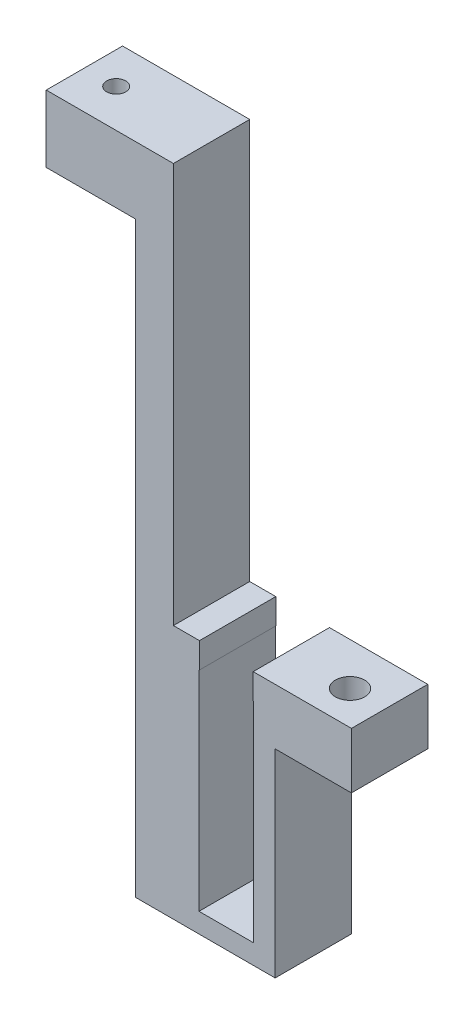
ISO-10303-21;
HEADER;
FILE_DESCRIPTION(('STEP AP214'),'2;1');
FILE_NAME('part.step','',(''),(''),'','','');
FILE_SCHEMA(('AUTOMOTIVE_DESIGN { 1 0 10303 214 1 1 1 1 }'));
ENDSEC;
DATA;
#1=APPLICATION_CONTEXT('core data for automotive mechanical design processes');
#2=APPLICATION_PROTOCOL_DEFINITION('international standard','automotive_design',2000,#1);
#3=PRODUCT_CONTEXT('',#1,'mechanical');
#4=PRODUCT('Part','Part','',(#3));
#5=PRODUCT_RELATED_PRODUCT_CATEGORY('part','',(#4));
#6=PRODUCT_DEFINITION_FORMATION('','',#4);
#7=PRODUCT_DEFINITION_CONTEXT('part definition',#1,'design');
#8=PRODUCT_DEFINITION('design','',#6,#7);
#9=PRODUCT_DEFINITION_SHAPE('','',#8);
#10=(LENGTH_UNIT() NAMED_UNIT(*) SI_UNIT(.MILLI.,.METRE.));
#11=(NAMED_UNIT(*) PLANE_ANGLE_UNIT() SI_UNIT($,.RADIAN.));
#12=(NAMED_UNIT(*) SI_UNIT($,.STERADIAN.) SOLID_ANGLE_UNIT());
#13=UNCERTAINTY_MEASURE_WITH_UNIT(LENGTH_MEASURE(1.E-05),#10,'distance_accuracy_value','');
#14=(GEOMETRIC_REPRESENTATION_CONTEXT(3) GLOBAL_UNCERTAINTY_ASSIGNED_CONTEXT((#13)) GLOBAL_UNIT_ASSIGNED_CONTEXT((#10,
#11,#12)) REPRESENTATION_CONTEXT('',''));
#15=CARTESIAN_POINT('',(0.,0.,0.));
#16=DIRECTION('',(0.,0.,1.));
#17=DIRECTION('',(1.,0.,0.));
#18=AXIS2_PLACEMENT_3D('',#15,#16,#17);
#19=CARTESIAN_POINT('',(-12.686283245385,0.,0.));
#20=DIRECTION('',(1.,0.,0.));
#21=DIRECTION('',(0.,1.,0.));
#22=AXIS2_PLACEMENT_3D('',#19,#20,#21);
#23=PLANE('',#22);
#24=DIRECTION('',(0.,0.,1.));
#25=VECTOR('',#24,1.);
#26=CARTESIAN_POINT('',(-12.686283245385,38.3890826070114,0.));
#27=LINE('',#26,#25);
#28=CARTESIAN_POINT('',(-12.686283245385,38.3890826070114,0.));
#29=VERTEX_POINT('',#28);
#30=CARTESIAN_POINT('',(-12.686283245385,38.3890826070114,6.));
#31=VERTEX_POINT('',#30);
#32=EDGE_CURVE('E50',#29,#31,#27,.T.);
#33=ORIENTED_EDGE('',*,*,#32,.F.);
#34=DIRECTION('',(0.,-1.,0.));
#35=VECTOR('',#34,1.);
#36=CARTESIAN_POINT('',(-12.686283245385,-7.80864350149818,0.));
#37=LINE('',#36,#35);
#38=CARTESIAN_POINT('',(-12.686283245385,-7.80864350149818,0.));
#39=VERTEX_POINT('',#38);
#40=EDGE_CURVE('E343',#29,#39,#37,.T.);
#41=ORIENTED_EDGE('',*,*,#40,.T.);
#42=DIRECTION('',(0.,0.,1.));
#43=VECTOR('',#42,1.);
#44=CARTESIAN_POINT('',(-12.686283245385,-7.80864350149818,0.));
#45=LINE('',#44,#43);
#46=CARTESIAN_POINT('',(-12.686283245385,-7.80864350149818,6.));
#47=VERTEX_POINT('',#46);
#48=EDGE_CURVE('E448',#39,#47,#45,.T.);
#49=ORIENTED_EDGE('',*,*,#48,.T.);
#50=DIRECTION('',(0.,1.,0.));
#51=VECTOR('',#50,1.);
#52=CARTESIAN_POINT('',(-12.686283245385,-7.80864350149818,6.));
#53=LINE('',#52,#51);
#54=EDGE_CURVE('E216',#47,#31,#53,.T.);
#55=ORIENTED_EDGE('',*,*,#54,.T.);
#56=EDGE_LOOP('',(#33,#41,#49,#55));
#57=FACE_BOUND('',#56,.T.);
#58=ADVANCED_FACE('F33',(#57),#23,.F.);
#59=CARTESIAN_POINT('',(-1.68628324538501,12.1913564985018,6.));
#60=DIRECTION('',(-1.,0.,0.));
#61=DIRECTION('',(0.,-1.,0.));
#62=AXIS2_PLACEMENT_3D('',#59,#60,#61);
#63=PLANE('',#62);
#64=DIRECTION('',(0.,0.,-1.));
#65=VECTOR('',#64,1.);
#66=CARTESIAN_POINT('',(-1.68628324538501,7.79606668542954,6.));
#67=LINE('',#66,#65);
#68=CARTESIAN_POINT('',(-1.68628324538501,7.79606668542954,6.));
#69=VERTEX_POINT('',#68);
#70=CARTESIAN_POINT('',(-1.68628324538501,7.79606668542954,0.));
#71=VERTEX_POINT('',#70);
#72=EDGE_CURVE('E58',#69,#71,#67,.T.);
#73=ORIENTED_EDGE('',*,*,#72,.F.);
#74=DIRECTION('',(0.,1.,0.));
#75=VECTOR('',#74,1.);
#76=CARTESIAN_POINT('',(-1.68628324538501,12.1913564985018,6.));
#77=LINE('',#76,#75);
#78=CARTESIAN_POINT('',(-1.68628324538501,-7.80864350149818,6.));
#79=VERTEX_POINT('',#78);
#80=EDGE_CURVE('E168',#79,#69,#77,.T.);
#81=ORIENTED_EDGE('',*,*,#80,.F.);
#82=DIRECTION('',(0.,0.,-1.));
#83=VECTOR('',#82,1.);
#84=CARTESIAN_POINT('',(-1.68628324538501,-7.80864350149818,6.));
#85=LINE('',#84,#83);
#86=CARTESIAN_POINT('',(-1.68628324538501,-7.80864350149818,0.));
#87=VERTEX_POINT('',#86);
#88=EDGE_CURVE('E412',#79,#87,#85,.T.);
#89=ORIENTED_EDGE('',*,*,#88,.T.);
#90=DIRECTION('',(0.,1.,0.));
#91=VECTOR('',#90,1.);
#92=CARTESIAN_POINT('',(-1.68628324538501,12.1913564985018,0.));
#93=LINE('',#92,#91);
#94=EDGE_CURVE('E327',#87,#71,#93,.T.);
#95=ORIENTED_EDGE('',*,*,#94,.T.);
#96=EDGE_LOOP('',(#73,#81,#89,#95));
#97=FACE_BOUND('',#96,.T.);
#98=ADVANCED_FACE('F249',(#97),#63,.F.);
#99=CARTESIAN_POINT('',(-9.68628324538501,12.1913564985018,6.));
#100=DIRECTION('',(0.,-1.,0.));
#101=DIRECTION('',(0.,0.,-1.));
#102=AXIS2_PLACEMENT_3D('',#99,#100,#101);
#103=PLANE('',#102);
#104=CARTESIAN_POINT('',(1.53950418539403,12.1913564985018,3.33665114320771));
#105=DIRECTION('',(0.,1.,0.));
#106=DIRECTION('',(0.,0.,1.));
#107=AXIS2_PLACEMENT_3D('',#104,#105,#106);
#108=CIRCLE('',#107,1.15);
#109=CARTESIAN_POINT('',(1.53950418539403,12.1913564985018,4.48665114320771));
#110=VERTEX_POINT('',#109);
#111=EDGE_CURVE('E188',#110,#110,#108,.T.);
#112=ORIENTED_EDGE('',*,*,#111,.F.);
#113=EDGE_LOOP('',(#112));
#114=FACE_BOUND('',#113,.T.);
#115=DIRECTION('',(-1.,0.,0.));
#116=VECTOR('',#115,1.);
#117=CARTESIAN_POINT('',(-9.68628324538501,12.1913564985018,0.));
#118=LINE('',#117,#116);
#119=CARTESIAN_POINT('',(4.31371675461499,12.1913564985018,0.));
#120=VERTEX_POINT('',#119);
#121=CARTESIAN_POINT('',(-3.41452572534706,12.1913564985018,0.));
#122=VERTEX_POINT('',#121);
#123=EDGE_CURVE('E320',#120,#122,#118,.T.);
#124=ORIENTED_EDGE('',*,*,#123,.T.);
#125=DIRECTION('',(0.,0.,-1.));
#126=VECTOR('',#125,1.);
#127=CARTESIAN_POINT('',(-3.41452572534706,12.1913564985018,0.));
#128=LINE('',#127,#126);
#129=CARTESIAN_POINT('',(-3.41452572534706,12.1913564985018,6.));
#130=VERTEX_POINT('',#129);
#131=EDGE_CURVE('E321',#130,#122,#128,.T.);
#132=ORIENTED_EDGE('',*,*,#131,.F.);
#133=DIRECTION('',(-1.,0.,0.));
#134=VECTOR('',#133,1.);
#135=CARTESIAN_POINT('',(-9.68628324538501,12.1913564985018,6.));
#136=LINE('',#135,#134);
#137=CARTESIAN_POINT('',(4.31371675461499,12.1913564985018,6.));
#138=VERTEX_POINT('',#137);
#139=EDGE_CURVE('E342',#138,#130,#136,.T.);
#140=ORIENTED_EDGE('',*,*,#139,.F.);
#141=DIRECTION('',(0.,0.,1.));
#142=VECTOR('',#141,1.);
#143=CARTESIAN_POINT('',(4.31371675461499,12.1913564985018,6.));
#144=LINE('',#143,#142);
#145=EDGE_CURVE('E185',#120,#138,#144,.T.);
#146=ORIENTED_EDGE('',*,*,#145,.F.);
#147=EDGE_LOOP('',(#124,#132,#140,#146));
#148=FACE_BOUND('',#147,.T.);
#149=ADVANCED_FACE('F256',(#114,#148),#103,.F.);
#150=CARTESIAN_POINT('',(-3.38628324538504,10.1913564985018,-4.));
#151=DIRECTION('',(0.,1.,0.));
#152=DIRECTION('',(0.,0.,1.));
#153=AXIS2_PLACEMENT_3D('',#150,#151,#152);
#154=PLANE('',#153);
#155=DIRECTION('',(-1.,0.,0.));
#156=VECTOR('',#155,1.);
#157=CARTESIAN_POINT('',(-3.38628324538504,10.1913564985018,6.));
#158=LINE('',#157,#156);
#159=CARTESIAN_POINT('',(-3.38628324538504,10.1913564985018,6.));
#160=VERTEX_POINT('',#159);
#161=CARTESIAN_POINT('',(-3.41452572534706,10.1913564985018,6.));
#162=VERTEX_POINT('',#161);
#163=EDGE_CURVE('E375',#160,#162,#158,.T.);
#164=ORIENTED_EDGE('',*,*,#163,.T.);
#165=DIRECTION('',(0.,0.,1.));
#166=VECTOR('',#165,1.);
#167=CARTESIAN_POINT('',(-3.41452572534706,10.1913564985018,0.));
#168=LINE('',#167,#166);
#169=CARTESIAN_POINT('',(-3.41452572534706,10.1913564985018,0.));
#170=VERTEX_POINT('',#169);
#171=EDGE_CURVE('E392',#170,#162,#168,.T.);
#172=ORIENTED_EDGE('',*,*,#171,.F.);
#173=DIRECTION('',(-1.,0.,0.));
#174=VECTOR('',#173,1.);
#175=CARTESIAN_POINT('',(0.,10.1913564985018,0.));
#176=LINE('',#175,#174);
#177=CARTESIAN_POINT('',(-3.38628324538504,10.1913564985018,0.));
#178=VERTEX_POINT('',#177);
#179=EDGE_CURVE('E414',#178,#170,#176,.T.);
#180=ORIENTED_EDGE('',*,*,#179,.F.);
#181=DIRECTION('',(0.,0.,1.));
#182=VECTOR('',#181,1.);
#183=CARTESIAN_POINT('',(-3.38628324538504,10.1913564985018,-4.));
#184=LINE('',#183,#182);
#185=EDGE_CURVE('E366',#178,#160,#184,.T.);
#186=ORIENTED_EDGE('',*,*,#185,.T.);
#187=EDGE_LOOP('',(#164,#172,#180,#186));
#188=FACE_BOUND('',#187,.T.);
#189=ADVANCED_FACE('F290',(#188),#154,.F.);
#190=CARTESIAN_POINT('',(-9.68628324538501,-7.80864350149818,6.));
#191=DIRECTION('',(0.,1.,0.));
#192=DIRECTION('',(0.,0.,1.));
#193=AXIS2_PLACEMENT_3D('',#190,#191,#192);
#194=PLANE('',#193);
#195=DIRECTION('',(1.,0.,0.));
#196=VECTOR('',#195,1.);
#197=CARTESIAN_POINT('',(-9.68628324538501,-7.80864350149818,0.));
#198=LINE('',#197,#196);
#199=EDGE_CURVE('E347',#39,#87,#198,.T.);
#200=ORIENTED_EDGE('',*,*,#199,.T.);
#201=ORIENTED_EDGE('',*,*,#88,.F.);
#202=DIRECTION('',(1.,0.,0.));
#203=VECTOR('',#202,1.);
#204=CARTESIAN_POINT('',(-9.68628324538501,-7.80864350149818,6.));
#205=LINE('',#204,#203);
#206=EDGE_CURVE('E323',#47,#79,#205,.T.);
#207=ORIENTED_EDGE('',*,*,#206,.F.);
#208=ORIENTED_EDGE('',*,*,#48,.F.);
#209=EDGE_LOOP('',(#200,#201,#207,#208));
#210=FACE_BOUND('',#209,.T.);
#211=ADVANCED_FACE('F35',(#210),#194,.F.);
#212=CARTESIAN_POINT('',(-7.63707552946613,12.1913564985018,6.));
#213=VERTEX_POINT('',#212);
#214=CARTESIAN_POINT('',(-9.68628324538501,12.1913564985018,6.));
#215=VERTEX_POINT('',#214);
#216=EDGE_CURVE('E340',#213,#215,#136,.T.);
#217=ORIENTED_EDGE('',*,*,#216,.F.);
#218=DIRECTION('',(0.,0.,1.));
#219=VECTOR('',#218,1.);
#220=CARTESIAN_POINT('',(-7.63707552946613,12.1913564985018,0.));
#221=LINE('',#220,#219);
#222=CARTESIAN_POINT('',(-7.63707552946613,12.1913564985018,0.));
#223=VERTEX_POINT('',#222);
#224=EDGE_CURVE('E394',#223,#213,#221,.T.);
#225=ORIENTED_EDGE('',*,*,#224,.F.);
#226=CARTESIAN_POINT('',(-9.68628324538501,12.1913564985018,0.));
#227=VERTEX_POINT('',#226);
#228=EDGE_CURVE('E324',#223,#227,#118,.T.);
#229=ORIENTED_EDGE('',*,*,#228,.T.);
#230=DIRECTION('',(0.,0.,-1.));
#231=VECTOR('',#230,1.);
#232=CARTESIAN_POINT('',(-9.68628324538501,12.1913564985018,6.));
#233=LINE('',#232,#231);
#234=EDGE_CURVE('E338',#215,#227,#233,.T.);
#235=ORIENTED_EDGE('',*,*,#234,.F.);
#236=EDGE_LOOP('',(#217,#225,#229,#235));
#237=FACE_BOUND('',#236,.T.);
#238=ADVANCED_FACE('F297',(#237),#103,.F.);
#239=CARTESIAN_POINT('',(0.,0.,6.));
#240=DIRECTION('',(0.,0.,1.));
#241=DIRECTION('',(1.,0.,0.));
#242=AXIS2_PLACEMENT_3D('',#239,#240,#241);
#243=PLANE('',#242);
#244=DIRECTION('',(0.,1.,0.));
#245=VECTOR('',#244,1.);
#246=CARTESIAN_POINT('',(-3.41452572534706,-7.80964350149818,6.));
#247=LINE('',#246,#245);
#248=EDGE_CURVE('E387',#162,#130,#247,.T.);
#249=ORIENTED_EDGE('',*,*,#248,.F.);
#250=ORIENTED_EDGE('',*,*,#163,.F.);
#251=DIRECTION('',(0.,1.,0.));
#252=VECTOR('',#251,1.);
#253=CARTESIAN_POINT('',(-3.38628324538504,10.1913564985018,6.));
#254=LINE('',#253,#252);
#255=CARTESIAN_POINT('',(-3.38628324538504,-6.26020039339892,6.));
#256=VERTEX_POINT('',#255);
#257=EDGE_CURVE('E381',#256,#160,#254,.T.);
#258=ORIENTED_EDGE('',*,*,#257,.F.);
#259=DIRECTION('',(1.,0.,0.));
#260=VECTOR('',#259,1.);
#261=CARTESIAN_POINT('',(-3.38628324538504,-6.26020039339892,6.));
#262=LINE('',#261,#260);
#263=CARTESIAN_POINT('',(-7.67544752794524,-6.26020039339892,6.));
#264=VERTEX_POINT('',#263);
#265=EDGE_CURVE('E361',#264,#256,#262,.T.);
#266=ORIENTED_EDGE('',*,*,#265,.F.);
#267=DIRECTION('',(0.,-1.,0.));
#268=VECTOR('',#267,1.);
#269=CARTESIAN_POINT('',(-7.67544752794524,10.1913564985018,6.));
#270=LINE('',#269,#268);
#271=CARTESIAN_POINT('',(-7.67544752794524,10.1913564985018,6.));
#272=VERTEX_POINT('',#271);
#273=EDGE_CURVE('E371',#272,#264,#270,.T.);
#274=ORIENTED_EDGE('',*,*,#273,.F.);
#275=CARTESIAN_POINT('',(-7.63707552946613,10.1913564985018,6.));
#276=VERTEX_POINT('',#275);
#277=EDGE_CURVE('E378',#276,#272,#158,.T.);
#278=ORIENTED_EDGE('',*,*,#277,.F.);
#279=DIRECTION('',(0.,1.,0.));
#280=VECTOR('',#279,1.);
#281=CARTESIAN_POINT('',(-7.63707552946613,-7.80964350149818,6.));
#282=LINE('',#281,#280);
#283=EDGE_CURVE('E383',#276,#213,#282,.T.);
#284=ORIENTED_EDGE('',*,*,#283,.T.);
#285=ORIENTED_EDGE('',*,*,#216,.T.);
#286=DIRECTION('',(0.,1.,0.));
#287=VECTOR('',#286,1.);
#288=CARTESIAN_POINT('',(-9.68628324538501,-7.80864350149818,6.));
#289=LINE('',#288,#287);
#290=CARTESIAN_POINT('',(-9.68628324538501,43.6610390835099,6.));
#291=VERTEX_POINT('',#290);
#292=EDGE_CURVE('E400',#215,#291,#289,.T.);
#293=ORIENTED_EDGE('',*,*,#292,.T.);
#294=DIRECTION('',(1.,0.,0.));
#295=VECTOR('',#294,1.);
#296=CARTESIAN_POINT('',(-12.686283245385,43.6610390835099,6.));
#297=LINE('',#296,#295);
#298=CARTESIAN_POINT('',(-19.686283245385,43.6610390835099,6.));
#299=VERTEX_POINT('',#298);
#300=EDGE_CURVE('E406',#299,#291,#297,.T.);
#301=ORIENTED_EDGE('',*,*,#300,.F.);
#302=DIRECTION('',(0.,1.,0.));
#303=VECTOR('',#302,1.);
#304=CARTESIAN_POINT('',(-19.686283245385,43.6610390835099,6.));
#305=LINE('',#304,#303);
#306=CARTESIAN_POINT('',(-19.686283245385,38.3890826070114,6.));
#307=VERTEX_POINT('',#306);
#308=EDGE_CURVE('E202',#307,#299,#305,.T.);
#309=ORIENTED_EDGE('',*,*,#308,.F.);
#310=DIRECTION('',(1.,0.,0.));
#311=VECTOR('',#310,1.);
#312=CARTESIAN_POINT('',(-19.686283245385,38.3890826070114,6.));
#313=LINE('',#312,#311);
#314=EDGE_CURVE('E208',#307,#31,#313,.T.);
#315=ORIENTED_EDGE('',*,*,#314,.T.);
#316=ORIENTED_EDGE('',*,*,#54,.F.);
#317=ORIENTED_EDGE('',*,*,#206,.T.);
#318=ORIENTED_EDGE('',*,*,#80,.T.);
#319=DIRECTION('',(-1.,0.,0.));
#320=VECTOR('',#319,1.);
#321=CARTESIAN_POINT('',(1.31371675461499,7.79606668542954,6.));
#322=LINE('',#321,#320);
#323=CARTESIAN_POINT('',(4.31371675461499,7.79606668542954,6.));
#324=VERTEX_POINT('',#323);
#325=EDGE_CURVE('E161',#324,#69,#322,.T.);
#326=ORIENTED_EDGE('',*,*,#325,.F.);
#327=DIRECTION('',(0.,-1.,0.));
#328=VECTOR('',#327,1.);
#329=CARTESIAN_POINT('',(4.31371675461499,12.1913564985018,6.));
#330=LINE('',#329,#328);
#331=EDGE_CURVE('E167',#138,#324,#330,.T.);
#332=ORIENTED_EDGE('',*,*,#331,.F.);
#333=ORIENTED_EDGE('',*,*,#139,.T.);
#334=EDGE_LOOP('',(#249,#250,#258,#266,#274,#278,#284,#285,#293,#301,#309,#315,#316,#317,#318,
#326,#332,#333));
#335=FACE_BOUND('',#334,.T.);
#336=ADVANCED_FACE('F164',(#335),#243,.T.);
#337=CARTESIAN_POINT('',(0.,0.,0.));
#338=DIRECTION('',(0.,0.,1.));
#339=DIRECTION('',(1.,0.,0.));
#340=AXIS2_PLACEMENT_3D('',#337,#338,#339);
#341=PLANE('',#340);
#342=ORIENTED_EDGE('',*,*,#179,.T.);
#343=DIRECTION('',(0.,1.,0.));
#344=VECTOR('',#343,1.);
#345=CARTESIAN_POINT('',(-3.41452572534706,-7.80964350149818,0.));
#346=LINE('',#345,#344);
#347=EDGE_CURVE('E389',#170,#122,#346,.T.);
#348=ORIENTED_EDGE('',*,*,#347,.T.);
#349=ORIENTED_EDGE('',*,*,#123,.F.);
#350=DIRECTION('',(0.,1.,0.));
#351=VECTOR('',#350,1.);
#352=CARTESIAN_POINT('',(4.31371675461499,12.1913564985018,0.));
#353=LINE('',#352,#351);
#354=CARTESIAN_POINT('',(4.31371675461499,7.79606668542954,0.));
#355=VERTEX_POINT('',#354);
#356=EDGE_CURVE('E180',#355,#120,#353,.T.);
#357=ORIENTED_EDGE('',*,*,#356,.F.);
#358=DIRECTION('',(-1.,0.,0.));
#359=VECTOR('',#358,1.);
#360=CARTESIAN_POINT('',(1.31371675461499,7.79606668542954,0.));
#361=LINE('',#360,#359);
#362=EDGE_CURVE('E171',#355,#71,#361,.T.);
#363=ORIENTED_EDGE('',*,*,#362,.T.);
#364=ORIENTED_EDGE('',*,*,#94,.F.);
#365=ORIENTED_EDGE('',*,*,#199,.F.);
#366=ORIENTED_EDGE('',*,*,#40,.F.);
#367=DIRECTION('',(1.,0.,0.));
#368=VECTOR('',#367,1.);
#369=CARTESIAN_POINT('',(-19.686283245385,38.3890826070114,0.));
#370=LINE('',#369,#368);
#371=CARTESIAN_POINT('',(-19.686283245385,38.3890826070114,0.));
#372=VERTEX_POINT('',#371);
#373=EDGE_CURVE('E221',#372,#29,#370,.T.);
#374=ORIENTED_EDGE('',*,*,#373,.F.);
#375=DIRECTION('',(0.,-1.,0.));
#376=VECTOR('',#375,1.);
#377=CARTESIAN_POINT('',(-19.686283245385,43.6610390835099,0.));
#378=LINE('',#377,#376);
#379=CARTESIAN_POINT('',(-19.686283245385,43.6610390835099,0.));
#380=VERTEX_POINT('',#379);
#381=EDGE_CURVE('E197',#380,#372,#378,.T.);
#382=ORIENTED_EDGE('',*,*,#381,.F.);
#383=DIRECTION('',(1.,0.,0.));
#384=VECTOR('',#383,1.);
#385=CARTESIAN_POINT('',(-12.686283245385,43.6610390835099,0.));
#386=LINE('',#385,#384);
#387=CARTESIAN_POINT('',(-9.68628324538501,43.6610390835099,0.));
#388=VERTEX_POINT('',#387);
#389=EDGE_CURVE('E446',#380,#388,#386,.T.);
#390=ORIENTED_EDGE('',*,*,#389,.T.);
#391=DIRECTION('',(0.,-1.,0.));
#392=VECTOR('',#391,1.);
#393=CARTESIAN_POINT('',(-9.68628324538501,-7.80864350149818,0.));
#394=LINE('',#393,#392);
#395=EDGE_CURVE('E226',#388,#227,#394,.T.);
#396=ORIENTED_EDGE('',*,*,#395,.T.);
#397=ORIENTED_EDGE('',*,*,#228,.F.);
#398=DIRECTION('',(0.,1.,0.));
#399=VECTOR('',#398,1.);
#400=CARTESIAN_POINT('',(-7.63707552946613,-7.80964350149818,0.));
#401=LINE('',#400,#399);
#402=CARTESIAN_POINT('',(-7.63707552946613,10.1913564985018,0.));
#403=VERTEX_POINT('',#402);
#404=EDGE_CURVE('E386',#403,#223,#401,.T.);
#405=ORIENTED_EDGE('',*,*,#404,.F.);
#406=CARTESIAN_POINT('',(-7.67544752794524,10.1913564985018,0.));
#407=VERTEX_POINT('',#406);
#408=EDGE_CURVE('E413',#403,#407,#176,.T.);
#409=ORIENTED_EDGE('',*,*,#408,.T.);
#410=DIRECTION('',(0.,-1.,0.));
#411=VECTOR('',#410,1.);
#412=CARTESIAN_POINT('',(-7.67544752794524,0.,0.));
#413=LINE('',#412,#411);
#414=CARTESIAN_POINT('',(-7.67544752794524,-6.26020039339892,0.));
#415=VERTEX_POINT('',#414);
#416=EDGE_CURVE('E418',#407,#415,#413,.T.);
#417=ORIENTED_EDGE('',*,*,#416,.T.);
#418=DIRECTION('',(1.,0.,0.));
#419=VECTOR('',#418,1.);
#420=CARTESIAN_POINT('',(0.,-6.26020039339892,0.));
#421=LINE('',#420,#419);
#422=CARTESIAN_POINT('',(-3.38628324538504,-6.26020039339892,0.));
#423=VERTEX_POINT('',#422);
#424=EDGE_CURVE('E42',#415,#423,#421,.T.);
#425=ORIENTED_EDGE('',*,*,#424,.T.);
#426=DIRECTION('',(0.,1.,0.));
#427=VECTOR('',#426,1.);
#428=CARTESIAN_POINT('',(-3.38628324538504,0.,0.));
#429=LINE('',#428,#427);
#430=EDGE_CURVE('E11',#423,#178,#429,.T.);
#431=ORIENTED_EDGE('',*,*,#430,.T.);
#432=EDGE_LOOP('',(#342,#348,#349,#357,#363,#364,#365,#366,#374,#382,#390,#396,#397,#405,#409,
#417,#425,#431));
#433=FACE_BOUND('',#432,.T.);
#434=ADVANCED_FACE('F293',(#433),#341,.F.);
#435=CARTESIAN_POINT('',(-3.38628324538504,10.1913564985018,-4.));
#436=DIRECTION('',(1.,0.,0.));
#437=DIRECTION('',(0.,0.,-1.));
#438=AXIS2_PLACEMENT_3D('',#435,#436,#437);
#439=PLANE('',#438);
#440=DIRECTION('',(0.,0.,1.));
#441=VECTOR('',#440,1.);
#442=CARTESIAN_POINT('',(-3.38628324538504,-6.26020039339892,-4.));
#443=LINE('',#442,#441);
#444=EDGE_CURVE('E348',#423,#256,#443,.T.);
#445=ORIENTED_EDGE('',*,*,#444,.T.);
#446=ORIENTED_EDGE('',*,*,#257,.T.);
#447=ORIENTED_EDGE('',*,*,#185,.F.);
#448=ORIENTED_EDGE('',*,*,#430,.F.);
#449=EDGE_LOOP('',(#445,#446,#447,#448));
#450=FACE_BOUND('',#449,.T.);
#451=ADVANCED_FACE('F282',(#450),#439,.F.);
#452=CARTESIAN_POINT('',(-3.38628324538504,-6.26020039339892,-4.));
#453=DIRECTION('',(0.,-1.,0.));
#454=DIRECTION('',(0.,0.,-1.));
#455=AXIS2_PLACEMENT_3D('',#452,#453,#454);
#456=PLANE('',#455);
#457=DIRECTION('',(0.,0.,1.));
#458=VECTOR('',#457,1.);
#459=CARTESIAN_POINT('',(-7.67544752794524,-6.26020039339892,-4.));
#460=LINE('',#459,#458);
#461=EDGE_CURVE('E354',#415,#264,#460,.T.);
#462=ORIENTED_EDGE('',*,*,#461,.T.);
#463=ORIENTED_EDGE('',*,*,#265,.T.);
#464=ORIENTED_EDGE('',*,*,#444,.F.);
#465=ORIENTED_EDGE('',*,*,#424,.F.);
#466=EDGE_LOOP('',(#462,#463,#464,#465));
#467=FACE_BOUND('',#466,.T.);
#468=ADVANCED_FACE('F278',(#467),#456,.F.);
#469=CARTESIAN_POINT('',(-7.67544752794524,10.1913564985018,-4.));
#470=DIRECTION('',(-1.,0.,0.));
#471=DIRECTION('',(0.,-1.,0.));
#472=AXIS2_PLACEMENT_3D('',#469,#470,#471);
#473=PLANE('',#472);
#474=DIRECTION('',(0.,0.,1.));
#475=VECTOR('',#474,1.);
#476=CARTESIAN_POINT('',(-7.67544752794524,10.1913564985018,-4.));
#477=LINE('',#476,#475);
#478=EDGE_CURVE('E358',#407,#272,#477,.T.);
#479=ORIENTED_EDGE('',*,*,#478,.T.);
#480=ORIENTED_EDGE('',*,*,#273,.T.);
#481=ORIENTED_EDGE('',*,*,#461,.F.);
#482=ORIENTED_EDGE('',*,*,#416,.F.);
#483=EDGE_LOOP('',(#479,#480,#481,#482));
#484=FACE_BOUND('',#483,.T.);
#485=ADVANCED_FACE('F281',(#484),#473,.F.);
#486=ORIENTED_EDGE('',*,*,#408,.F.);
#487=DIRECTION('',(0.,0.,-1.));
#488=VECTOR('',#487,1.);
#489=CARTESIAN_POINT('',(-7.63707552946613,10.1913564985018,0.));
#490=LINE('',#489,#488);
#491=EDGE_CURVE('E170',#276,#403,#490,.T.);
#492=ORIENTED_EDGE('',*,*,#491,.F.);
#493=ORIENTED_EDGE('',*,*,#277,.T.);
#494=ORIENTED_EDGE('',*,*,#478,.F.);
#495=EDGE_LOOP('',(#486,#492,#493,#494));
#496=FACE_BOUND('',#495,.T.);
#497=ADVANCED_FACE('F274',(#496),#154,.F.);
#498=CARTESIAN_POINT('',(-7.63707552946613,-7.80964350149818,0.));
#499=DIRECTION('',(-1.,0.,0.));
#500=DIRECTION('',(0.,0.,1.));
#501=AXIS2_PLACEMENT_3D('',#498,#499,#500);
#502=PLANE('',#501);
#503=ORIENTED_EDGE('',*,*,#491,.T.);
#504=ORIENTED_EDGE('',*,*,#404,.T.);
#505=ORIENTED_EDGE('',*,*,#224,.T.);
#506=ORIENTED_EDGE('',*,*,#283,.F.);
#507=EDGE_LOOP('',(#503,#504,#505,#506));
#508=FACE_BOUND('',#507,.T.);
#509=ADVANCED_FACE('F271',(#508),#502,.F.);
#510=CARTESIAN_POINT('',(-3.41452572534706,-7.80964350149818,0.));
#511=DIRECTION('',(1.,0.,0.));
#512=DIRECTION('',(0.,0.,-1.));
#513=AXIS2_PLACEMENT_3D('',#510,#511,#512);
#514=PLANE('',#513);
#515=ORIENTED_EDGE('',*,*,#171,.T.);
#516=ORIENTED_EDGE('',*,*,#248,.T.);
#517=ORIENTED_EDGE('',*,*,#131,.T.);
#518=ORIENTED_EDGE('',*,*,#347,.F.);
#519=EDGE_LOOP('',(#515,#516,#517,#518));
#520=FACE_BOUND('',#519,.T.);
#521=ADVANCED_FACE('F269',(#520),#514,.F.);
#522=CARTESIAN_POINT('',(1.31371675461499,7.79606668542954,6.));
#523=DIRECTION('',(0.,1.,0.));
#524=DIRECTION('',(-1.,0.,0.));
#525=AXIS2_PLACEMENT_3D('',#522,#523,#524);
#526=PLANE('',#525);
#527=CARTESIAN_POINT('',(1.53950418539403,7.79606668542954,3.33665114320771));
#528=DIRECTION('',(0.,1.,0.));
#529=DIRECTION('',(-1.,0.,0.));
#530=AXIS2_PLACEMENT_3D('',#527,#528,#529);
#531=CIRCLE('',#530,1.15);
#532=CARTESIAN_POINT('',(1.53950418539403,7.79606668542954,4.48665114320771));
#533=VERTEX_POINT('',#532);
#534=EDGE_CURVE('E37',#533,#533,#531,.T.);
#535=ORIENTED_EDGE('',*,*,#534,.T.);
#536=EDGE_LOOP('',(#535));
#537=FACE_BOUND('',#536,.T.);
#538=ORIENTED_EDGE('',*,*,#72,.T.);
#539=ORIENTED_EDGE('',*,*,#362,.F.);
#540=DIRECTION('',(0.,0.,-1.));
#541=VECTOR('',#540,1.);
#542=CARTESIAN_POINT('',(4.31371675461499,7.79606668542954,6.));
#543=LINE('',#542,#541);
#544=EDGE_CURVE('E174',#324,#355,#543,.T.);
#545=ORIENTED_EDGE('',*,*,#544,.F.);
#546=ORIENTED_EDGE('',*,*,#325,.T.);
#547=EDGE_LOOP('',(#538,#539,#545,#546));
#548=FACE_BOUND('',#547,.T.);
#549=ADVANCED_FACE('F175',(#537,#548),#526,.F.);
#550=CARTESIAN_POINT('',(-12.686283245385,43.6610390835099,0.));
#551=DIRECTION('',(0.,-1.,0.));
#552=DIRECTION('',(1.,0.,0.));
#553=AXIS2_PLACEMENT_3D('',#550,#551,#552);
#554=PLANE('',#553);
#555=CARTESIAN_POINT('',(-17.186283245385,43.6610390835099,3.));
#556=DIRECTION('',(0.,1.,0.));
#557=DIRECTION('',(-1.,0.,0.));
#558=AXIS2_PLACEMENT_3D('',#555,#556,#557);
#559=CIRCLE('',#558,0.750000000000002);
#560=CARTESIAN_POINT('',(-17.936283245385,43.6610390835099,3.));
#561=VERTEX_POINT('',#560);
#562=EDGE_CURVE('E193',#561,#561,#559,.T.);
#563=ORIENTED_EDGE('',*,*,#562,.F.);
#564=EDGE_LOOP('',(#563));
#565=FACE_BOUND('',#564,.T.);
#566=DIRECTION('',(0.,0.,-1.));
#567=VECTOR('',#566,1.);
#568=CARTESIAN_POINT('',(-9.68628324538501,43.6610390835099,0.));
#569=LINE('',#568,#567);
#570=EDGE_CURVE('E437',#291,#388,#569,.T.);
#571=ORIENTED_EDGE('',*,*,#570,.T.);
#572=ORIENTED_EDGE('',*,*,#389,.F.);
#573=DIRECTION('',(0.,0.,-1.));
#574=VECTOR('',#573,1.);
#575=CARTESIAN_POINT('',(-19.686283245385,43.6610390835099,0.));
#576=LINE('',#575,#574);
#577=EDGE_CURVE('E205',#299,#380,#576,.T.);
#578=ORIENTED_EDGE('',*,*,#577,.F.);
#579=ORIENTED_EDGE('',*,*,#300,.T.);
#580=EDGE_LOOP('',(#571,#572,#578,#579));
#581=FACE_BOUND('',#580,.T.);
#582=ADVANCED_FACE('F262',(#565,#581),#554,.F.);
#583=CARTESIAN_POINT('',(-9.68628324538501,0.,0.));
#584=DIRECTION('',(1.,0.,0.));
#585=DIRECTION('',(0.,1.,0.));
#586=AXIS2_PLACEMENT_3D('',#583,#584,#585);
#587=PLANE('',#586);
#588=ORIENTED_EDGE('',*,*,#292,.F.);
#589=ORIENTED_EDGE('',*,*,#234,.T.);
#590=ORIENTED_EDGE('',*,*,#395,.F.);
#591=ORIENTED_EDGE('',*,*,#570,.F.);
#592=EDGE_LOOP('',(#588,#589,#590,#591));
#593=FACE_BOUND('',#592,.T.);
#594=ADVANCED_FACE('F259',(#593),#587,.T.);
#595=CARTESIAN_POINT('',(-19.686283245385,38.3890826070114,0.));
#596=DIRECTION('',(0.,1.,0.));
#597=DIRECTION('',(-1.,0.,0.));
#598=AXIS2_PLACEMENT_3D('',#595,#596,#597);
#599=PLANE('',#598);
#600=CARTESIAN_POINT('',(-17.186283245385,38.3890826070114,3.));
#601=DIRECTION('',(0.,1.,0.));
#602=DIRECTION('',(-1.,0.,0.));
#603=AXIS2_PLACEMENT_3D('',#600,#601,#602);
#604=CIRCLE('',#603,0.750000000000002);
#605=CARTESIAN_POINT('',(-17.936283245385,38.3890826070114,3.));
#606=VERTEX_POINT('',#605);
#607=EDGE_CURVE('E196',#606,#606,#604,.T.);
#608=ORIENTED_EDGE('',*,*,#607,.T.);
#609=EDGE_LOOP('',(#608));
#610=FACE_BOUND('',#609,.T.);
#611=ORIENTED_EDGE('',*,*,#32,.T.);
#612=ORIENTED_EDGE('',*,*,#314,.F.);
#613=DIRECTION('',(0.,0.,1.));
#614=VECTOR('',#613,1.);
#615=CARTESIAN_POINT('',(-19.686283245385,38.3890826070114,0.));
#616=LINE('',#615,#614);
#617=EDGE_CURVE('E200',#372,#307,#616,.T.);
#618=ORIENTED_EDGE('',*,*,#617,.F.);
#619=ORIENTED_EDGE('',*,*,#373,.T.);
#620=EDGE_LOOP('',(#611,#612,#618,#619));
#621=FACE_BOUND('',#620,.T.);
#622=ADVANCED_FACE('F231',(#610,#621),#599,.F.);
#623=CARTESIAN_POINT('',(-19.686283245385,0.,0.));
#624=DIRECTION('',(-1.,0.,0.));
#625=DIRECTION('',(0.,-1.,0.));
#626=AXIS2_PLACEMENT_3D('',#623,#624,#625);
#627=PLANE('',#626);
#628=ORIENTED_EDGE('',*,*,#381,.T.);
#629=ORIENTED_EDGE('',*,*,#617,.T.);
#630=ORIENTED_EDGE('',*,*,#308,.T.);
#631=ORIENTED_EDGE('',*,*,#577,.T.);
#632=EDGE_LOOP('',(#628,#629,#630,#631));
#633=FACE_BOUND('',#632,.T.);
#634=ADVANCED_FACE('F236',(#633),#627,.T.);
#635=CARTESIAN_POINT('',(-17.186283245385,-7.80866850149817,3.));
#636=DIRECTION('',(0.,1.,0.));
#637=DIRECTION('',(-1.,0.,0.));
#638=AXIS2_PLACEMENT_3D('',#635,#636,#637);
#639=CYLINDRICAL_SURFACE('',#638,0.750000000000002);
#640=ORIENTED_EDGE('',*,*,#562,.T.);
#641=EDGE_LOOP('',(#640));
#642=FACE_BOUND('',#641,.T.);
#643=ORIENTED_EDGE('',*,*,#607,.F.);
#644=EDGE_LOOP('',(#643));
#645=FACE_BOUND('',#644,.T.);
#646=ADVANCED_FACE('F234',(#642,#645),#639,.F.);
#647=CARTESIAN_POINT('',(4.31371675461499,0.,0.));
#648=DIRECTION('',(1.,0.,0.));
#649=DIRECTION('',(0.,1.,0.));
#650=AXIS2_PLACEMENT_3D('',#647,#648,#649);
#651=PLANE('',#650);
#652=ORIENTED_EDGE('',*,*,#331,.T.);
#653=ORIENTED_EDGE('',*,*,#544,.T.);
#654=ORIENTED_EDGE('',*,*,#356,.T.);
#655=ORIENTED_EDGE('',*,*,#145,.T.);
#656=EDGE_LOOP('',(#652,#653,#654,#655));
#657=FACE_BOUND('',#656,.T.);
#658=ADVANCED_FACE('F183',(#657),#651,.T.);
#659=CARTESIAN_POINT('',(1.53950418539403,-7.80866850149818,3.33665114320771));
#660=DIRECTION('',(0.,1.,0.));
#661=DIRECTION('',(0.,0.,1.));
#662=AXIS2_PLACEMENT_3D('',#659,#660,#661);
#663=CYLINDRICAL_SURFACE('',#662,1.15);
#664=CARTESIAN_POINT('',(1.53950418539403,12.1913564985018,4.48665114320771));
#665=CARTESIAN_POINT('',(1.53950418539403,12.1455722296157,4.48665114320771));
#666=CARTESIAN_POINT('',(1.53950418539403,12.0997879607295,4.48665114320771));
#667=CARTESIAN_POINT('',(1.53950418539403,12.0082194229571,4.48665114320771));
#668=CARTESIAN_POINT('',(1.53950418539403,11.962435154071,4.48665114320771));
#669=CARTESIAN_POINT('',(1.53950418539403,11.8708666162986,4.48665114320771));
#670=CARTESIAN_POINT('',(1.53950418539403,11.8250823474125,4.48665114320771));
#671=CARTESIAN_POINT('',(1.53950418539403,11.7335138096401,4.48665114320771));
#672=CARTESIAN_POINT('',(1.53950418539403,11.687729540754,4.48665114320771));
#673=CARTESIAN_POINT('',(1.53950418539403,11.5961610029816,4.48665114320771));
#674=CARTESIAN_POINT('',(1.53950418539403,11.5503767340954,4.48665114320771));
#675=CARTESIAN_POINT('',(1.53950418539403,11.4588081963231,4.48665114320771));
#676=CARTESIAN_POINT('',(1.53950418539403,11.4130239274369,4.48665114320771));
#677=CARTESIAN_POINT('',(1.53950418539403,11.3214553896646,4.48665114320771));
#678=CARTESIAN_POINT('',(1.53950418539403,11.2756711207784,4.48665114320771));
#679=CARTESIAN_POINT('',(1.53950418539403,11.1841025830061,4.48665114320771));
#680=CARTESIAN_POINT('',(1.53950418539403,11.1383183141199,4.48665114320771));
#681=CARTESIAN_POINT('',(1.53950418539403,11.0467497763476,4.48665114320771));
#682=CARTESIAN_POINT('',(1.53950418539403,11.0009655074614,4.48665114320771));
#683=CARTESIAN_POINT('',(1.53950418539403,10.9093969696891,4.48665114320771));
#684=CARTESIAN_POINT('',(1.53950418539403,10.8636127008029,4.48665114320771));
#685=CARTESIAN_POINT('',(1.53950418539403,10.7720441630306,4.48665114320771));
#686=CARTESIAN_POINT('',(1.53950418539403,10.7262598941444,4.48665114320771));
#687=CARTESIAN_POINT('',(1.53950418539403,10.6346913563721,4.48665114320771));
#688=CARTESIAN_POINT('',(1.53950418539403,10.5889070874859,4.48665114320771));
#689=CARTESIAN_POINT('',(1.53950418539403,10.4973385497135,4.48665114320771));
#690=CARTESIAN_POINT('',(1.53950418539403,10.4515542808274,4.48665114320771));
#691=CARTESIAN_POINT('',(1.53950418539403,10.359985743055,4.48665114320771));
#692=CARTESIAN_POINT('',(1.53950418539403,10.3142014741689,4.48665114320771));
#693=CARTESIAN_POINT('',(1.53950418539403,10.2226329363965,4.48665114320771));
#694=CARTESIAN_POINT('',(1.53950418539403,10.1768486675104,4.48665114320771));
#695=CARTESIAN_POINT('',(1.53950418539403,10.085280129738,4.48665114320771));
#696=CARTESIAN_POINT('',(1.53950418539403,10.0394958608518,4.48665114320771));
#697=CARTESIAN_POINT('',(1.53950418539403,9.94792732307951,4.48665114320771));
#698=CARTESIAN_POINT('',(1.53950418539403,9.90214305419334,4.48665114320771));
#699=CARTESIAN_POINT('',(1.53950418539403,9.810574516421,4.48665114320771));
#700=CARTESIAN_POINT('',(1.53950418539403,9.76479024753483,4.48665114320771));
#701=CARTESIAN_POINT('',(1.53950418539403,9.67322170976249,4.48665114320771));
#702=CARTESIAN_POINT('',(1.53950418539403,9.62743744087632,4.48665114320771));
#703=CARTESIAN_POINT('',(1.53950418539403,9.53586890310398,4.48665114320771));
#704=CARTESIAN_POINT('',(1.53950418539403,9.49008463421781,4.48665114320771));
#705=CARTESIAN_POINT('',(1.53950418539403,9.39851609644547,4.48665114320771));
#706=CARTESIAN_POINT('',(1.53950418539403,9.3527318275593,4.48665114320771));
#707=CARTESIAN_POINT('',(1.53950418539403,9.26116328978696,4.48665114320771));
#708=CARTESIAN_POINT('',(1.53950418539403,9.21537902090079,4.48665114320771));
#709=CARTESIAN_POINT('',(1.53950418539403,9.12381048312846,4.48665114320771));
#710=CARTESIAN_POINT('',(1.53950418539403,9.07802621424229,4.48665114320771));
#711=CARTESIAN_POINT('',(1.53950418539403,8.98645767646995,4.48665114320771));
#712=CARTESIAN_POINT('',(1.53950418539403,8.94067340758378,4.48665114320771));
#713=CARTESIAN_POINT('',(1.53950418539403,8.84910486981144,4.48665114320771));
#714=CARTESIAN_POINT('',(1.53950418539403,8.80332060092527,4.48665114320771));
#715=CARTESIAN_POINT('',(1.53950418539403,8.71175206315293,4.48665114320771));
#716=CARTESIAN_POINT('',(1.53950418539403,8.66596779426676,4.48665114320771));
#717=CARTESIAN_POINT('',(1.53950418539403,8.57439925649442,4.48665114320771));
#718=CARTESIAN_POINT('',(1.53950418539403,8.52861498760825,4.48665114320771));
#719=CARTESIAN_POINT('',(1.53950418539403,8.43704644983591,4.48665114320771));
#720=CARTESIAN_POINT('',(1.53950418539403,8.39126218094974,4.48665114320771));
#721=CARTESIAN_POINT('',(1.53950418539403,8.2996936431774,4.48665114320771));
#722=CARTESIAN_POINT('',(1.53950418539403,8.25390937429123,4.48665114320771));
#723=CARTESIAN_POINT('',(1.53950418539403,8.16234083651889,4.48665114320771));
#724=CARTESIAN_POINT('',(1.53950418539403,8.11655656763272,4.48665114320771));
#725=CARTESIAN_POINT('',(1.53950418539403,8.02498802986038,4.48665114320771));
#726=CARTESIAN_POINT('',(1.53950418539403,7.97920376097421,4.48665114320771));
#727=CARTESIAN_POINT('',(1.53950418539403,7.88763522320187,4.48665114320771));
#728=CARTESIAN_POINT('',(1.53950418539403,7.8418509543157,4.48665114320771));
#729=CARTESIAN_POINT('',(1.53950418539403,7.79606668542954,4.48665114320771));
#730=B_SPLINE_CURVE_WITH_KNOTS('',3,(#664,#665,#666,#667,#668,#669,#670,#671,#672,#673,#674,
#675,#676,#677,#678,#679,#680,#681,#682,#683,#684,#685,#686,#687,#688,#689,#690,#691,#692,#693,
#694,#695,#696,#697,#698,#699,#700,#701,#702,#703,#704,#705,#706,#707,#708,#709,#710,#711,#712,
#713,#714,#715,#716,#717,#718,#719,#720,#721,#722,#723,#724,#725,#726,#727,#728,#729),
.UNSPECIFIED.,.F.,.F.,(4,2,2,2,2,2,2,2,2,2,2,2,2,2,2,2,2,2,2,2,2,2,2,2,2,2,2,2,2,2,2,2,4),(0.,
0.137352806658508,0.274705613317019,0.412058419975526,0.549411226634038,0.686764033292545,
0.824116839951053,0.961469646609564,1.09882245326807,1.23617525992658,1.37352806658509,
1.5108808732436,1.64823367990211,1.78558648656062,1.92293929321913,2.06029209987764,
2.19764490653614,2.33499771319465,2.47235051985316,2.60970332651167,2.74705613317018,
2.88440893982869,3.0217617464872,3.15911455314571,3.29646735980422,3.43382016646273,
3.57117297312123,3.70852577977975,3.84587858643825,3.98323139309676,4.12058419975527,
4.25793700641378,4.39528981307229),.UNSPECIFIED.);
#731=EDGE_CURVE('BSEAM244',#110,#533,#730,.T.);
#732=ORIENTED_EDGE('',*,*,#111,.T.);
#733=ORIENTED_EDGE('',*,*,#534,.F.);
#734=ORIENTED_EDGE('',*,*,#731,.T.);
#735=ORIENTED_EDGE('',*,*,#731,.F.);
#736=EDGE_LOOP('',(#732,#734,#733,#735));
#737=FACE_BOUND('',#736,.T.);
#738=ADVANCED_FACE('F244',(#737),#663,.F.);
#739=CLOSED_SHELL('',(#58,#98,#149,#189,#211,#238,#336,#434,#451,#468,#485,#497,#509,#521,#549,
#582,#594,#622,#634,#646,#658,#738));
#740=MANIFOLD_SOLID_BREP('B2',#739);
#741=ADVANCED_BREP_SHAPE_REPRESENTATION('',(#18,#740),#14);
#742=SHAPE_DEFINITION_REPRESENTATION(#9,#741);
ENDSEC;
END-ISO-10303-21;
